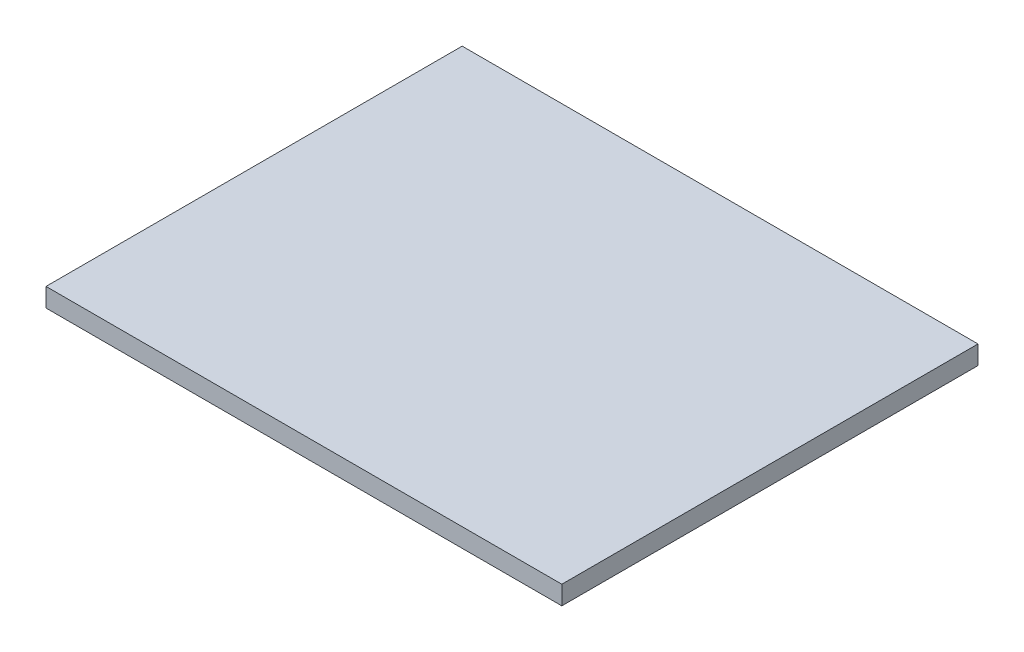
ISO-10303-21;
HEADER;
FILE_DESCRIPTION(('STEP AP214'),'2;1');
FILE_NAME('part.step','',(''),(''),'','','');
FILE_SCHEMA(('AUTOMOTIVE_DESIGN { 1 0 10303 214 1 1 1 1 }'));
ENDSEC;
DATA;
#1=APPLICATION_CONTEXT('core data for automotive mechanical design processes');
#2=APPLICATION_PROTOCOL_DEFINITION('international standard','automotive_design',2000,#1);
#3=PRODUCT_CONTEXT('',#1,'mechanical');
#4=PRODUCT('Part','Part','',(#3));
#5=PRODUCT_RELATED_PRODUCT_CATEGORY('part','',(#4));
#6=PRODUCT_DEFINITION_FORMATION('','',#4);
#7=PRODUCT_DEFINITION_CONTEXT('part definition',#1,'design');
#8=PRODUCT_DEFINITION('design','',#6,#7);
#9=PRODUCT_DEFINITION_SHAPE('','',#8);
#10=(LENGTH_UNIT() NAMED_UNIT(*) SI_UNIT(.MILLI.,.METRE.));
#11=(NAMED_UNIT(*) PLANE_ANGLE_UNIT() SI_UNIT($,.RADIAN.));
#12=(NAMED_UNIT(*) SI_UNIT($,.STERADIAN.) SOLID_ANGLE_UNIT());
#13=UNCERTAINTY_MEASURE_WITH_UNIT(LENGTH_MEASURE(1.E-05),#10,'distance_accuracy_value','');
#14=(GEOMETRIC_REPRESENTATION_CONTEXT(3) GLOBAL_UNCERTAINTY_ASSIGNED_CONTEXT((#13)) GLOBAL_UNIT_ASSIGNED_CONTEXT((#10,
#11,#12)) REPRESENTATION_CONTEXT('',''));
#15=CARTESIAN_POINT('',(0.,0.,0.));
#16=DIRECTION('',(0.,0.,1.));
#17=DIRECTION('',(1.,0.,0.));
#18=AXIS2_PLACEMENT_3D('',#15,#16,#17);
#19=CARTESIAN_POINT('',(22.,1.6,17.75));
#20=DIRECTION('',(-1.,0.,0.));
#21=DIRECTION('',(0.,0.,1.));
#22=AXIS2_PLACEMENT_3D('',#19,#20,#21);
#23=PLANE('',#22);
#24=DIRECTION('',(0.,0.,-1.));
#25=VECTOR('',#24,1.);
#26=CARTESIAN_POINT('',(22.,0.,17.75));
#27=LINE('',#26,#25);
#28=CARTESIAN_POINT('',(22.,0.,17.75));
#29=VERTEX_POINT('',#28);
#30=CARTESIAN_POINT('',(22.,0.,-17.75));
#31=VERTEX_POINT('',#30);
#32=EDGE_CURVE('E98',#29,#31,#27,.T.);
#33=ORIENTED_EDGE('',*,*,#32,.T.);
#34=DIRECTION('',(0.,-1.,0.));
#35=VECTOR('',#34,1.);
#36=CARTESIAN_POINT('',(22.,1.6,-17.75));
#37=LINE('',#36,#35);
#38=CARTESIAN_POINT('',(22.,1.6,-17.75));
#39=VERTEX_POINT('',#38);
#40=EDGE_CURVE('E11',#39,#31,#37,.T.);
#41=ORIENTED_EDGE('',*,*,#40,.F.);
#42=DIRECTION('',(0.,0.,-1.));
#43=VECTOR('',#42,1.);
#44=CARTESIAN_POINT('',(22.,1.6,17.75));
#45=LINE('',#44,#43);
#46=CARTESIAN_POINT('',(22.,1.6,17.75));
#47=VERTEX_POINT('',#46);
#48=EDGE_CURVE('E86',#47,#39,#45,.T.);
#49=ORIENTED_EDGE('',*,*,#48,.F.);
#50=DIRECTION('',(0.,-1.,0.));
#51=VECTOR('',#50,1.);
#52=CARTESIAN_POINT('',(22.,1.6,17.75));
#53=LINE('',#52,#51);
#54=EDGE_CURVE('E94',#47,#29,#53,.T.);
#55=ORIENTED_EDGE('',*,*,#54,.T.);
#56=EDGE_LOOP('',(#33,#41,#49,#55));
#57=FACE_BOUND('',#56,.T.);
#58=ADVANCED_FACE('F35',(#57),#23,.F.);
#59=CARTESIAN_POINT('',(-22.,1.6,-17.75));
#60=DIRECTION('',(0.,0.,1.));
#61=DIRECTION('',(1.,0.,0.));
#62=AXIS2_PLACEMENT_3D('',#59,#60,#61);
#63=PLANE('',#62);
#64=DIRECTION('',(-1.,0.,0.));
#65=VECTOR('',#64,1.);
#66=CARTESIAN_POINT('',(-22.,0.,-17.75));
#67=LINE('',#66,#65);
#68=CARTESIAN_POINT('',(-22.,0.,-17.75));
#69=VERTEX_POINT('',#68);
#70=EDGE_CURVE('E90',#31,#69,#67,.T.);
#71=ORIENTED_EDGE('',*,*,#70,.T.);
#72=DIRECTION('',(0.,-1.,0.));
#73=VECTOR('',#72,1.);
#74=CARTESIAN_POINT('',(-22.,1.6,-17.75));
#75=LINE('',#74,#73);
#76=CARTESIAN_POINT('',(-22.,1.6,-17.75));
#77=VERTEX_POINT('',#76);
#78=EDGE_CURVE('E43',#77,#69,#75,.T.);
#79=ORIENTED_EDGE('',*,*,#78,.F.);
#80=DIRECTION('',(-1.,0.,0.));
#81=VECTOR('',#80,1.);
#82=CARTESIAN_POINT('',(-22.,1.6,-17.75));
#83=LINE('',#82,#81);
#84=EDGE_CURVE('E81',#39,#77,#83,.T.);
#85=ORIENTED_EDGE('',*,*,#84,.F.);
#86=ORIENTED_EDGE('',*,*,#40,.T.);
#87=EDGE_LOOP('',(#71,#79,#85,#86));
#88=FACE_BOUND('',#87,.T.);
#89=ADVANCED_FACE('F89',(#88),#63,.F.);
#90=CARTESIAN_POINT('',(-22.,1.6,17.75));
#91=DIRECTION('',(1.,0.,0.));
#92=DIRECTION('',(0.,0.,-1.));
#93=AXIS2_PLACEMENT_3D('',#90,#91,#92);
#94=PLANE('',#93);
#95=DIRECTION('',(0.,0.,1.));
#96=VECTOR('',#95,1.);
#97=CARTESIAN_POINT('',(-22.,0.,17.75));
#98=LINE('',#97,#96);
#99=CARTESIAN_POINT('',(-22.,0.,17.75));
#100=VERTEX_POINT('',#99);
#101=EDGE_CURVE('E68',#69,#100,#98,.T.);
#102=ORIENTED_EDGE('',*,*,#101,.T.);
#103=DIRECTION('',(0.,-1.,0.));
#104=VECTOR('',#103,1.);
#105=CARTESIAN_POINT('',(-22.,1.6,17.75));
#106=LINE('',#105,#104);
#107=CARTESIAN_POINT('',(-22.,1.6,17.75));
#108=VERTEX_POINT('',#107);
#109=EDGE_CURVE('E91',#108,#100,#106,.T.);
#110=ORIENTED_EDGE('',*,*,#109,.F.);
#111=DIRECTION('',(0.,0.,1.));
#112=VECTOR('',#111,1.);
#113=CARTESIAN_POINT('',(-22.,1.6,17.75));
#114=LINE('',#113,#112);
#115=EDGE_CURVE('E84',#77,#108,#114,.T.);
#116=ORIENTED_EDGE('',*,*,#115,.F.);
#117=ORIENTED_EDGE('',*,*,#78,.T.);
#118=EDGE_LOOP('',(#102,#110,#116,#117));
#119=FACE_BOUND('',#118,.T.);
#120=ADVANCED_FACE('F92',(#119),#94,.F.);
#121=CARTESIAN_POINT('',(-22.,1.6,17.75));
#122=DIRECTION('',(0.,0.,-1.));
#123=DIRECTION('',(-1.,0.,0.));
#124=AXIS2_PLACEMENT_3D('',#121,#122,#123);
#125=PLANE('',#124);
#126=DIRECTION('',(1.,0.,0.));
#127=VECTOR('',#126,1.);
#128=CARTESIAN_POINT('',(-22.,0.,17.75));
#129=LINE('',#128,#127);
#130=EDGE_CURVE('E74',#100,#29,#129,.T.);
#131=ORIENTED_EDGE('',*,*,#130,.T.);
#132=ORIENTED_EDGE('',*,*,#54,.F.);
#133=DIRECTION('',(1.,0.,0.));
#134=VECTOR('',#133,1.);
#135=CARTESIAN_POINT('',(-22.,1.6,17.75));
#136=LINE('',#135,#134);
#137=EDGE_CURVE('E51',#108,#47,#136,.T.);
#138=ORIENTED_EDGE('',*,*,#137,.F.);
#139=ORIENTED_EDGE('',*,*,#109,.T.);
#140=EDGE_LOOP('',(#131,#132,#138,#139));
#141=FACE_BOUND('',#140,.T.);
#142=ADVANCED_FACE('F105',(#141),#125,.F.);
#143=CARTESIAN_POINT('',(0.,1.6,0.));
#144=DIRECTION('',(0.,-1.,0.));
#145=DIRECTION('',(0.,0.,-1.));
#146=AXIS2_PLACEMENT_3D('',#143,#144,#145);
#147=PLANE('',#146);
#148=ORIENTED_EDGE('',*,*,#48,.T.);
#149=ORIENTED_EDGE('',*,*,#84,.T.);
#150=ORIENTED_EDGE('',*,*,#115,.T.);
#151=ORIENTED_EDGE('',*,*,#137,.T.);
#152=EDGE_LOOP('',(#148,#149,#150,#151));
#153=FACE_BOUND('',#152,.T.);
#154=ADVANCED_FACE('F82',(#153),#147,.F.);
#155=CARTESIAN_POINT('',(0.,0.,0.));
#156=DIRECTION('',(0.,-1.,0.));
#157=DIRECTION('',(0.,0.,-1.));
#158=AXIS2_PLACEMENT_3D('',#155,#156,#157);
#159=PLANE('',#158);
#160=ORIENTED_EDGE('',*,*,#32,.F.);
#161=ORIENTED_EDGE('',*,*,#130,.F.);
#162=ORIENTED_EDGE('',*,*,#101,.F.);
#163=ORIENTED_EDGE('',*,*,#70,.F.);
#164=EDGE_LOOP('',(#160,#161,#162,#163));
#165=FACE_BOUND('',#164,.T.);
#166=ADVANCED_FACE('F108',(#165),#159,.T.);
#167=CLOSED_SHELL('',(#58,#89,#120,#142,#154,#166));
#168=MANIFOLD_SOLID_BREP('B2',#167);
#169=ADVANCED_BREP_SHAPE_REPRESENTATION('',(#18,#168),#14);
#170=SHAPE_DEFINITION_REPRESENTATION(#9,#169);
ENDSEC;
END-ISO-10303-21;
